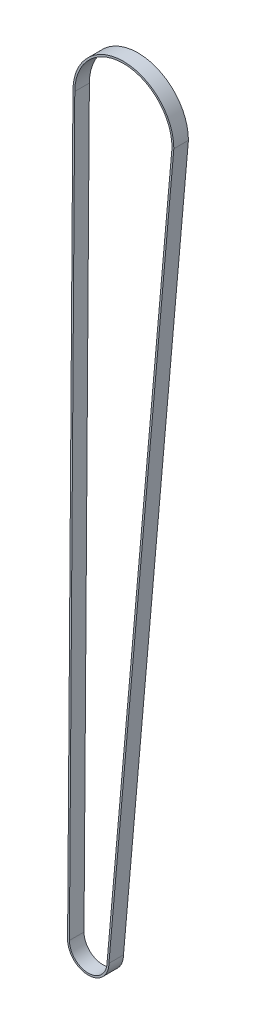
ISO-10303-21;
HEADER;
FILE_DESCRIPTION(('STEP AP214'),'2;1');
FILE_NAME('part.step','',(''),(''),'','','');
FILE_SCHEMA(('AUTOMOTIVE_DESIGN { 1 0 10303 214 1 1 1 1 }'));
ENDSEC;
DATA;
#1=APPLICATION_CONTEXT('core data for automotive mechanical design processes');
#2=APPLICATION_PROTOCOL_DEFINITION('international standard','automotive_design',2000,#1);
#3=PRODUCT_CONTEXT('',#1,'mechanical');
#4=PRODUCT('Part','Part','',(#3));
#5=PRODUCT_RELATED_PRODUCT_CATEGORY('part','',(#4));
#6=PRODUCT_DEFINITION_FORMATION('','',#4);
#7=PRODUCT_DEFINITION_CONTEXT('part definition',#1,'design');
#8=PRODUCT_DEFINITION('design','',#6,#7);
#9=PRODUCT_DEFINITION_SHAPE('','',#8);
#10=(LENGTH_UNIT() NAMED_UNIT(*) SI_UNIT(.MILLI.,.METRE.));
#11=(NAMED_UNIT(*) PLANE_ANGLE_UNIT() SI_UNIT($,.RADIAN.));
#12=(NAMED_UNIT(*) SI_UNIT($,.STERADIAN.) SOLID_ANGLE_UNIT());
#13=UNCERTAINTY_MEASURE_WITH_UNIT(LENGTH_MEASURE(1.E-05),#10,'distance_accuracy_value','');
#14=(GEOMETRIC_REPRESENTATION_CONTEXT(3) GLOBAL_UNCERTAINTY_ASSIGNED_CONTEXT((#13)) GLOBAL_UNIT_ASSIGNED_CONTEXT((#10,
#11,#12)) REPRESENTATION_CONTEXT('',''));
#15=CARTESIAN_POINT('',(0.,0.,0.));
#16=DIRECTION('',(0.,0.,1.));
#17=DIRECTION('',(1.,0.,0.));
#18=AXIS2_PLACEMENT_3D('',#15,#16,#17);
#19=CARTESIAN_POINT('',(10.7566762488183,157.600714590694,6.));
#20=DIRECTION('',(0.,0.,-1.));
#21=DIRECTION('',(-1.,0.,0.));
#22=AXIS2_PLACEMENT_3D('',#19,#20,#21);
#23=PLANE('',#22);
#24=CARTESIAN_POINT('',(10.7566762488183,157.600714590694,6.));
#25=DIRECTION('',(0.,0.,1.));
#26=DIRECTION('',(-1.,0.,0.));
#27=AXIS2_PLACEMENT_3D('',#24,#25,#26);
#28=CIRCLE('',#27,20.75);
#29=CARTESIAN_POINT('',(31.5066496414726,157.567485023491,6.));
#30=VERTEX_POINT('',#29);
#31=CARTESIAN_POINT('',(-9.99332356835283,157.603469114252,6.));
#32=VERTEX_POINT('',#31);
#33=EDGE_CURVE('E140',#30,#32,#28,.T.);
#34=ORIENTED_EDGE('',*,*,#33,.T.);
#35=DIRECTION('',(-0.00727831573908165,-0.999973512709213,0.));
#36=VECTOR('',#35,1.);
#37=CARTESIAN_POINT('',(-9.99332356835283,157.603469114252,6.));
#38=LINE('',#37,#36);
#39=CARTESIAN_POINT('',(-12.203121145594,-146.0023546651,6.));
#40=VERTEX_POINT('',#39);
#41=EDGE_CURVE('E143',#32,#40,#38,.T.);
#42=ORIENTED_EDGE('',*,*,#41,.T.);
#43=CARTESIAN_POINT('',(-3.7031216042781,-146.005147088615,6.));
#44=DIRECTION('',(0.,0.,1.));
#45=DIRECTION('',(1.,0.,0.));
#46=AXIS2_PLACEMENT_3D('',#43,#44,#45);
#47=CIRCLE('',#46,8.49999999999992);
#48=CARTESIAN_POINT('',(4.79681164622923,-146.038832944973,6.));
#49=VERTEX_POINT('',#48);
#50=EDGE_CURVE('E146',#40,#49,#47,.T.);
#51=ORIENTED_EDGE('',*,*,#50,.T.);
#52=DIRECTION('',(0.0876367528250514,0.996152498141866,0.));
#53=VECTOR('',#52,1.);
#54=CARTESIAN_POINT('',(4.79681164622923,-146.038832944973,6.));
#55=LINE('',#54,#53);
#56=EDGE_CURVE('E148',#49,#30,#55,.T.);
#57=ORIENTED_EDGE('',*,*,#56,.T.);
#58=EDGE_LOOP('',(#34,#42,#51,#57));
#59=FACE_BOUND('',#58,.T.);
#60=CARTESIAN_POINT('',(10.7566762488183,157.600714590694,6.));
#61=DIRECTION('',(0.,0.,1.));
#62=DIRECTION('',(-1.,0.,0.));
#63=AXIS2_PLACEMENT_3D('',#60,#61,#62);
#64=CIRCLE('',#63,20.);
#65=CARTESIAN_POINT('',(30.7566762488183,157.600714590694,6.));
#66=VERTEX_POINT('',#65);
#67=CARTESIAN_POINT('',(-9.24332375118175,157.600714590694,6.));
#68=VERTEX_POINT('',#67);
#69=EDGE_CURVE('E104',#66,#68,#64,.T.);
#70=ORIENTED_EDGE('',*,*,#69,.F.);
#71=DIRECTION('',(0.0876367528250513,0.996152498141866,0.));
#72=VECTOR('',#71,1.);
#73=CARTESIAN_POINT('',(4.04687839572182,-146.005147088615,6.));
#74=LINE('',#73,#72);
#75=CARTESIAN_POINT('',(4.04687839572182,-146.005147088615,6.));
#76=VERTEX_POINT('',#75);
#77=EDGE_CURVE('E126',#76,#66,#74,.T.);
#78=ORIENTED_EDGE('',*,*,#77,.F.);
#79=CARTESIAN_POINT('',(-3.7031216042781,-146.005147088615,6.));
#80=DIRECTION('',(0.,0.,1.));
#81=DIRECTION('',(1.,0.,0.));
#82=AXIS2_PLACEMENT_3D('',#79,#80,#81);
#83=CIRCLE('',#82,7.74999999999992);
#84=CARTESIAN_POINT('',(-11.453121604278,-146.005147088615,6.));
#85=VERTEX_POINT('',#84);
#86=EDGE_CURVE('E124',#85,#76,#83,.T.);
#87=ORIENTED_EDGE('',*,*,#86,.F.);
#88=DIRECTION('',(-0.00727831573908165,-0.999973512709213,0.));
#89=VECTOR('',#88,1.);
#90=CARTESIAN_POINT('',(-9.24332375118175,157.600714590694,6.));
#91=LINE('',#90,#89);
#92=EDGE_CURVE('E112',#68,#85,#91,.T.);
#93=ORIENTED_EDGE('',*,*,#92,.F.);
#94=EDGE_LOOP('',(#70,#78,#87,#93));
#95=FACE_BOUND('',#94,.T.);
#96=ADVANCED_FACE('F39',(#59,#95),#23,.F.);
#97=CARTESIAN_POINT('',(10.7566762488183,157.600714590694,0.));
#98=DIRECTION('',(0.,0.,-1.));
#99=DIRECTION('',(-1.,0.,0.));
#100=AXIS2_PLACEMENT_3D('',#97,#98,#99);
#101=PLANE('',#100);
#102=CARTESIAN_POINT('',(10.7566762488183,157.600714590694,0.));
#103=DIRECTION('',(0.,0.,1.));
#104=DIRECTION('',(-1.,0.,0.));
#105=AXIS2_PLACEMENT_3D('',#102,#103,#104);
#106=CIRCLE('',#105,20.75);
#107=CARTESIAN_POINT('',(31.5066496414726,157.567485023491,0.));
#108=VERTEX_POINT('',#107);
#109=CARTESIAN_POINT('',(-9.99332356835283,157.603469114252,0.));
#110=VERTEX_POINT('',#109);
#111=EDGE_CURVE('E120',#108,#110,#106,.T.);
#112=ORIENTED_EDGE('',*,*,#111,.F.);
#113=DIRECTION('',(0.0876367528250514,0.996152498141866,0.));
#114=VECTOR('',#113,1.);
#115=CARTESIAN_POINT('',(4.79681164622923,-146.038832944973,0.));
#116=LINE('',#115,#114);
#117=CARTESIAN_POINT('',(4.79681164622923,-146.038832944973,0.));
#118=VERTEX_POINT('',#117);
#119=EDGE_CURVE('E144',#118,#108,#116,.T.);
#120=ORIENTED_EDGE('',*,*,#119,.F.);
#121=CARTESIAN_POINT('',(-3.7031216042781,-146.005147088615,0.));
#122=DIRECTION('',(0.,0.,1.));
#123=DIRECTION('',(1.,0.,0.));
#124=AXIS2_PLACEMENT_3D('',#121,#122,#123);
#125=CIRCLE('',#124,8.49999999999992);
#126=CARTESIAN_POINT('',(-12.203121145594,-146.0023546651,0.));
#127=VERTEX_POINT('',#126);
#128=EDGE_CURVE('E155',#127,#118,#125,.T.);
#129=ORIENTED_EDGE('',*,*,#128,.F.);
#130=DIRECTION('',(-0.00727831573908165,-0.999973512709213,0.));
#131=VECTOR('',#130,1.);
#132=CARTESIAN_POINT('',(-9.99332356835283,157.603469114252,0.));
#133=LINE('',#132,#131);
#134=EDGE_CURVE('E153',#110,#127,#133,.T.);
#135=ORIENTED_EDGE('',*,*,#134,.F.);
#136=EDGE_LOOP('',(#112,#120,#129,#135));
#137=FACE_BOUND('',#136,.T.);
#138=DIRECTION('',(0.0876367528250513,0.996152498141866,0.));
#139=VECTOR('',#138,1.);
#140=CARTESIAN_POINT('',(4.04687839572182,-146.005147088615,0.));
#141=LINE('',#140,#139);
#142=CARTESIAN_POINT('',(4.04687839572182,-146.005147088615,0.));
#143=VERTEX_POINT('',#142);
#144=CARTESIAN_POINT('',(30.7566762488183,157.600714590694,0.));
#145=VERTEX_POINT('',#144);
#146=EDGE_CURVE('E113',#143,#145,#141,.T.);
#147=ORIENTED_EDGE('',*,*,#146,.T.);
#148=CARTESIAN_POINT('',(10.7566762488183,157.600714590694,0.));
#149=DIRECTION('',(0.,0.,1.));
#150=DIRECTION('',(-1.,0.,0.));
#151=AXIS2_PLACEMENT_3D('',#148,#149,#150);
#152=CIRCLE('',#151,20.);
#153=CARTESIAN_POINT('',(-9.24332375118175,157.600714590694,0.));
#154=VERTEX_POINT('',#153);
#155=EDGE_CURVE('E62',#145,#154,#152,.T.);
#156=ORIENTED_EDGE('',*,*,#155,.T.);
#157=DIRECTION('',(-0.00727831573908165,-0.999973512709213,0.));
#158=VECTOR('',#157,1.);
#159=CARTESIAN_POINT('',(-9.24332375118175,157.600714590694,0.));
#160=LINE('',#159,#158);
#161=CARTESIAN_POINT('',(-11.453121604278,-146.005147088615,0.));
#162=VERTEX_POINT('',#161);
#163=EDGE_CURVE('E119',#154,#162,#160,.T.);
#164=ORIENTED_EDGE('',*,*,#163,.T.);
#165=CARTESIAN_POINT('',(-3.7031216042781,-146.005147088615,0.));
#166=DIRECTION('',(0.,0.,1.));
#167=DIRECTION('',(1.,0.,0.));
#168=AXIS2_PLACEMENT_3D('',#165,#166,#167);
#169=CIRCLE('',#168,7.74999999999992);
#170=EDGE_CURVE('E132',#162,#143,#169,.T.);
#171=ORIENTED_EDGE('',*,*,#170,.T.);
#172=EDGE_LOOP('',(#147,#156,#164,#171));
#173=FACE_BOUND('',#172,.T.);
#174=ADVANCED_FACE('F173',(#137,#173),#101,.T.);
#175=CARTESIAN_POINT('',(10.7566762488183,157.600714590694,6.));
#176=DIRECTION('',(0.,0.,-1.));
#177=DIRECTION('',(-1.,0.,0.));
#178=AXIS2_PLACEMENT_3D('',#175,#176,#177);
#179=CYLINDRICAL_SURFACE('',#178,20.75);
#180=ORIENTED_EDGE('',*,*,#111,.T.);
#181=DIRECTION('',(0.,0.,-1.));
#182=VECTOR('',#181,1.);
#183=CARTESIAN_POINT('',(-9.99332356835283,157.603469114252,6.));
#184=LINE('',#183,#182);
#185=EDGE_CURVE('E11',#32,#110,#184,.T.);
#186=ORIENTED_EDGE('',*,*,#185,.F.);
#187=ORIENTED_EDGE('',*,*,#33,.F.);
#188=DIRECTION('',(0.,0.,-1.));
#189=VECTOR('',#188,1.);
#190=CARTESIAN_POINT('',(31.5066496414726,157.567485023491,6.));
#191=LINE('',#190,#189);
#192=EDGE_CURVE('E150',#30,#108,#191,.T.);
#193=ORIENTED_EDGE('',*,*,#192,.T.);
#194=EDGE_LOOP('',(#180,#186,#187,#193));
#195=FACE_BOUND('',#194,.T.);
#196=ADVANCED_FACE('F41',(#195),#179,.T.);
#197=CARTESIAN_POINT('',(-9.99332356835283,157.603469114252,6.));
#198=DIRECTION('',(0.999973512709213,-0.00727831573908165,0.));
#199=DIRECTION('',(0.00727831573908165,0.999973512709213,0.));
#200=AXIS2_PLACEMENT_3D('',#197,#198,#199);
#201=PLANE('',#200);
#202=ORIENTED_EDGE('',*,*,#134,.T.);
#203=DIRECTION('',(0.,0.,-1.));
#204=VECTOR('',#203,1.);
#205=CARTESIAN_POINT('',(-12.203121145594,-146.0023546651,6.));
#206=LINE('',#205,#204);
#207=EDGE_CURVE('E47',#40,#127,#206,.T.);
#208=ORIENTED_EDGE('',*,*,#207,.F.);
#209=ORIENTED_EDGE('',*,*,#41,.F.);
#210=ORIENTED_EDGE('',*,*,#185,.T.);
#211=EDGE_LOOP('',(#202,#208,#209,#210));
#212=FACE_BOUND('',#211,.T.);
#213=ADVANCED_FACE('F183',(#212),#201,.F.);
#214=CARTESIAN_POINT('',(-3.7031216042781,-146.005147088615,6.));
#215=DIRECTION('',(0.,0.,-1.));
#216=DIRECTION('',(-1.,0.,0.));
#217=AXIS2_PLACEMENT_3D('',#214,#215,#216);
#218=CYLINDRICAL_SURFACE('',#217,8.49999999999992);
#219=ORIENTED_EDGE('',*,*,#128,.T.);
#220=DIRECTION('',(0.,0.,-1.));
#221=VECTOR('',#220,1.);
#222=CARTESIAN_POINT('',(4.79681164622923,-146.038832944973,6.));
#223=LINE('',#222,#221);
#224=EDGE_CURVE('E160',#49,#118,#223,.T.);
#225=ORIENTED_EDGE('',*,*,#224,.F.);
#226=ORIENTED_EDGE('',*,*,#50,.F.);
#227=ORIENTED_EDGE('',*,*,#207,.T.);
#228=EDGE_LOOP('',(#219,#225,#226,#227));
#229=FACE_BOUND('',#228,.T.);
#230=ADVANCED_FACE('F167',(#229),#218,.T.);
#231=CARTESIAN_POINT('',(4.79681164622923,-146.038832944973,6.));
#232=DIRECTION('',(-0.996152498141866,0.0876367528250514,0.));
#233=DIRECTION('',(-0.0876367528250514,-0.996152498141866,0.));
#234=AXIS2_PLACEMENT_3D('',#231,#232,#233);
#235=PLANE('',#234);
#236=ORIENTED_EDGE('',*,*,#119,.T.);
#237=ORIENTED_EDGE('',*,*,#192,.F.);
#238=ORIENTED_EDGE('',*,*,#56,.F.);
#239=ORIENTED_EDGE('',*,*,#224,.T.);
#240=EDGE_LOOP('',(#236,#237,#238,#239));
#241=FACE_BOUND('',#240,.T.);
#242=ADVANCED_FACE('F177',(#241),#235,.F.);
#243=CARTESIAN_POINT('',(10.7566762488183,157.600714590694,6.));
#244=DIRECTION('',(0.,0.,-1.));
#245=DIRECTION('',(-1.,0.,0.));
#246=AXIS2_PLACEMENT_3D('',#243,#244,#245);
#247=CYLINDRICAL_SURFACE('',#246,20.);
#248=ORIENTED_EDGE('',*,*,#155,.F.);
#249=DIRECTION('',(0.,0.,-1.));
#250=VECTOR('',#249,1.);
#251=CARTESIAN_POINT('',(30.7566762488183,157.600714590694,6.));
#252=LINE('',#251,#250);
#253=EDGE_CURVE('E108',#66,#145,#252,.T.);
#254=ORIENTED_EDGE('',*,*,#253,.F.);
#255=ORIENTED_EDGE('',*,*,#69,.T.);
#256=DIRECTION('',(0.,0.,-1.));
#257=VECTOR('',#256,1.);
#258=CARTESIAN_POINT('',(-9.24332375118175,157.600714590694,6.));
#259=LINE('',#258,#257);
#260=EDGE_CURVE('E107',#68,#154,#259,.T.);
#261=ORIENTED_EDGE('',*,*,#260,.T.);
#262=EDGE_LOOP('',(#248,#254,#255,#261));
#263=FACE_BOUND('',#262,.T.);
#264=ADVANCED_FACE('F106',(#263),#247,.F.);
#265=CARTESIAN_POINT('',(-9.24332375118175,157.600714590694,6.));
#266=DIRECTION('',(0.999973512709213,-0.00727831573908165,0.));
#267=DIRECTION('',(0.00727831573908165,0.999973512709213,0.));
#268=AXIS2_PLACEMENT_3D('',#265,#266,#267);
#269=PLANE('',#268);
#270=ORIENTED_EDGE('',*,*,#163,.F.);
#271=ORIENTED_EDGE('',*,*,#260,.F.);
#272=ORIENTED_EDGE('',*,*,#92,.T.);
#273=DIRECTION('',(0.,0.,-1.));
#274=VECTOR('',#273,1.);
#275=CARTESIAN_POINT('',(-11.453121604278,-146.005147088615,6.));
#276=LINE('',#275,#274);
#277=EDGE_CURVE('E121',#85,#162,#276,.T.);
#278=ORIENTED_EDGE('',*,*,#277,.T.);
#279=EDGE_LOOP('',(#270,#271,#272,#278));
#280=FACE_BOUND('',#279,.T.);
#281=ADVANCED_FACE('F116',(#280),#269,.T.);
#282=CARTESIAN_POINT('',(-3.7031216042781,-146.005147088615,6.));
#283=DIRECTION('',(0.,0.,-1.));
#284=DIRECTION('',(-1.,0.,0.));
#285=AXIS2_PLACEMENT_3D('',#282,#283,#284);
#286=CYLINDRICAL_SURFACE('',#285,7.74999999999992);
#287=ORIENTED_EDGE('',*,*,#170,.F.);
#288=ORIENTED_EDGE('',*,*,#277,.F.);
#289=ORIENTED_EDGE('',*,*,#86,.T.);
#290=DIRECTION('',(0.,0.,-1.));
#291=VECTOR('',#290,1.);
#292=CARTESIAN_POINT('',(4.04687839572182,-146.005147088615,6.));
#293=LINE('',#292,#291);
#294=EDGE_CURVE('E54',#76,#143,#293,.T.);
#295=ORIENTED_EDGE('',*,*,#294,.T.);
#296=EDGE_LOOP('',(#287,#288,#289,#295));
#297=FACE_BOUND('',#296,.T.);
#298=ADVANCED_FACE('F206',(#297),#286,.F.);
#299=CARTESIAN_POINT('',(4.04687839572182,-146.005147088615,6.));
#300=DIRECTION('',(-0.996152498141866,0.0876367528250514,0.));
#301=DIRECTION('',(-0.0876367528250514,-0.996152498141866,0.));
#302=AXIS2_PLACEMENT_3D('',#299,#300,#301);
#303=PLANE('',#302);
#304=ORIENTED_EDGE('',*,*,#146,.F.);
#305=ORIENTED_EDGE('',*,*,#294,.F.);
#306=ORIENTED_EDGE('',*,*,#77,.T.);
#307=ORIENTED_EDGE('',*,*,#253,.T.);
#308=EDGE_LOOP('',(#304,#305,#306,#307));
#309=FACE_BOUND('',#308,.T.);
#310=ADVANCED_FACE('F210',(#309),#303,.T.);
#311=CLOSED_SHELL('',(#96,#174,#196,#213,#230,#242,#264,#281,#298,#310));
#312=MANIFOLD_SOLID_BREP('B2',#311);
#313=ADVANCED_BREP_SHAPE_REPRESENTATION('',(#18,#312),#14);
#314=SHAPE_DEFINITION_REPRESENTATION(#9,#313);
ENDSEC;
END-ISO-10303-21;
